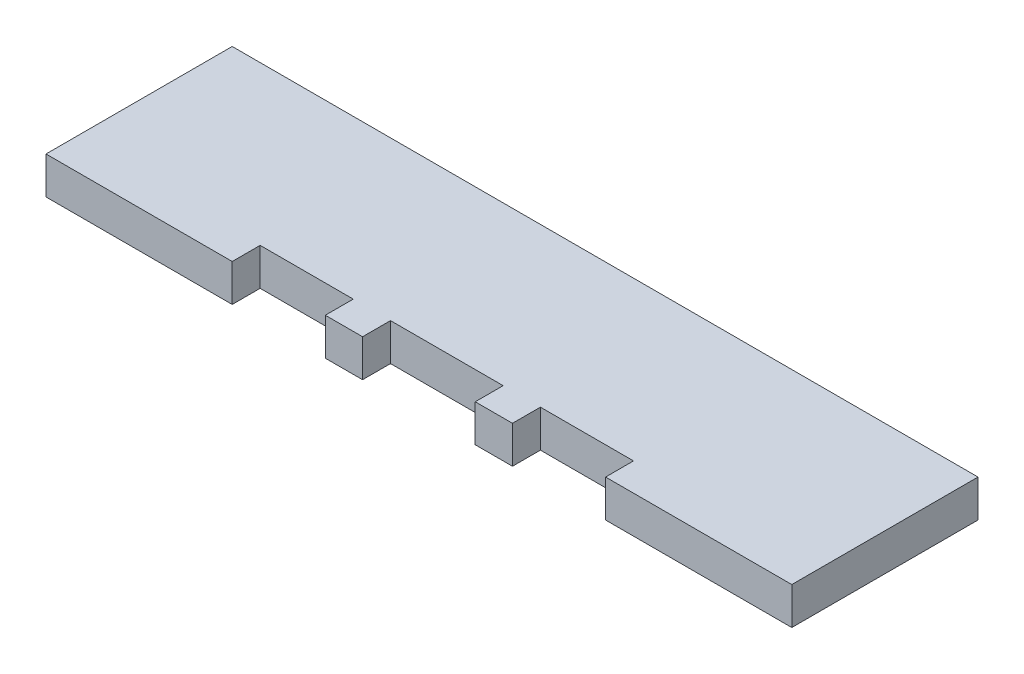
ISO-10303-21;
HEADER;
FILE_DESCRIPTION(('STEP AP214'),'2;1');
FILE_NAME('part.step','',(''),(''),'','','');
FILE_SCHEMA(('AUTOMOTIVE_DESIGN { 1 0 10303 214 1 1 1 1 }'));
ENDSEC;
DATA;
#1=APPLICATION_CONTEXT('core data for automotive mechanical design processes');
#2=APPLICATION_PROTOCOL_DEFINITION('international standard','automotive_design',2000,#1);
#3=PRODUCT_CONTEXT('',#1,'mechanical');
#4=PRODUCT('Part','Part','',(#3));
#5=PRODUCT_RELATED_PRODUCT_CATEGORY('part','',(#4));
#6=PRODUCT_DEFINITION_FORMATION('','',#4);
#7=PRODUCT_DEFINITION_CONTEXT('part definition',#1,'design');
#8=PRODUCT_DEFINITION('design','',#6,#7);
#9=PRODUCT_DEFINITION_SHAPE('','',#8);
#10=(LENGTH_UNIT() NAMED_UNIT(*) SI_UNIT(.MILLI.,.METRE.));
#11=(NAMED_UNIT(*) PLANE_ANGLE_UNIT() SI_UNIT($,.RADIAN.));
#12=(NAMED_UNIT(*) SI_UNIT($,.STERADIAN.) SOLID_ANGLE_UNIT());
#13=UNCERTAINTY_MEASURE_WITH_UNIT(LENGTH_MEASURE(1.E-05),#10,'distance_accuracy_value','');
#14=(GEOMETRIC_REPRESENTATION_CONTEXT(3) GLOBAL_UNCERTAINTY_ASSIGNED_CONTEXT((#13)) GLOBAL_UNIT_ASSIGNED_CONTEXT((#10,
#11,#12)) REPRESENTATION_CONTEXT('',''));
#15=CARTESIAN_POINT('',(0.,0.,0.));
#16=DIRECTION('',(0.,0.,1.));
#17=DIRECTION('',(1.,0.,0.));
#18=AXIS2_PLACEMENT_3D('',#15,#16,#17);
#19=CARTESIAN_POINT('',(0.,4.,-3.));
#20=DIRECTION('',(0.,0.,-1.));
#21=DIRECTION('',(-1.,0.,0.));
#22=AXIS2_PLACEMENT_3D('',#19,#20,#21);
#23=PLANE('',#22);
#24=DIRECTION('',(0.,-1.,0.));
#25=VECTOR('',#24,1.);
#26=CARTESIAN_POINT('',(10.,3.99999999999988,-3.));
#27=LINE('',#26,#25);
#28=CARTESIAN_POINT('',(10.,4.,-3.));
#29=VERTEX_POINT('',#28);
#30=CARTESIAN_POINT('',(10.,0.,-3.));
#31=VERTEX_POINT('',#30);
#32=EDGE_CURVE('E57',#29,#31,#27,.T.);
#33=ORIENTED_EDGE('',*,*,#32,.F.);
#34=DIRECTION('',(1.,0.,0.));
#35=VECTOR('',#34,1.);
#36=CARTESIAN_POINT('',(0.,4.,-3.));
#37=LINE('',#36,#35);
#38=CARTESIAN_POINT('',(0.,4.,-3.));
#39=VERTEX_POINT('',#38);
#40=EDGE_CURVE('E172',#39,#29,#37,.T.);
#41=ORIENTED_EDGE('',*,*,#40,.F.);
#42=DIRECTION('',(0.,-1.,0.));
#43=VECTOR('',#42,1.);
#44=CARTESIAN_POINT('',(0.,4.,-3.));
#45=LINE('',#44,#43);
#46=CARTESIAN_POINT('',(0.,0.,-3.));
#47=VERTEX_POINT('',#46);
#48=EDGE_CURVE('E42',#39,#47,#45,.T.);
#49=ORIENTED_EDGE('',*,*,#48,.T.);
#50=DIRECTION('',(1.,0.,0.));
#51=VECTOR('',#50,1.);
#52=CARTESIAN_POINT('',(0.,0.,-3.));
#53=LINE('',#52,#51);
#54=EDGE_CURVE('E229',#47,#31,#53,.T.);
#55=ORIENTED_EDGE('',*,*,#54,.T.);
#56=EDGE_LOOP('',(#33,#41,#49,#55));
#57=FACE_BOUND('',#56,.T.);
#58=ADVANCED_FACE('F34',(#57),#23,.F.);
#59=DIRECTION('',(0.,1.,0.));
#60=VECTOR('',#59,1.);
#61=CARTESIAN_POINT('',(14.,3.99999999999988,-3.));
#62=LINE('',#61,#60);
#63=CARTESIAN_POINT('',(14.,-1.23598439395047E-13,-3.));
#64=VERTEX_POINT('',#63);
#65=CARTESIAN_POINT('',(14.,4.,-3.));
#66=VERTEX_POINT('',#65);
#67=EDGE_CURVE('E168',#64,#66,#62,.T.);
#68=ORIENTED_EDGE('',*,*,#67,.F.);
#69=CARTESIAN_POINT('',(26.1,0.,-3.));
#70=VERTEX_POINT('',#69);
#71=EDGE_CURVE('E232',#64,#70,#53,.T.);
#72=ORIENTED_EDGE('',*,*,#71,.T.);
#73=DIRECTION('',(0.,-1.,0.));
#74=VECTOR('',#73,1.);
#75=CARTESIAN_POINT('',(26.1,4.,-3.));
#76=LINE('',#75,#74);
#77=CARTESIAN_POINT('',(26.1,4.,-3.));
#78=VERTEX_POINT('',#77);
#79=EDGE_CURVE('E173',#78,#70,#76,.T.);
#80=ORIENTED_EDGE('',*,*,#79,.F.);
#81=EDGE_CURVE('E49',#66,#78,#37,.T.);
#82=ORIENTED_EDGE('',*,*,#81,.F.);
#83=EDGE_LOOP('',(#68,#72,#80,#82));
#84=FACE_BOUND('',#83,.T.);
#85=ADVANCED_FACE('F277',(#84),#23,.F.);
#86=DIRECTION('',(0.,1.,0.));
#87=VECTOR('',#86,1.);
#88=CARTESIAN_POINT('',(30.1,4.,-3.));
#89=LINE('',#88,#87);
#90=CARTESIAN_POINT('',(30.1,0.,-3.));
#91=VERTEX_POINT('',#90);
#92=CARTESIAN_POINT('',(30.1,4.,-3.));
#93=VERTEX_POINT('',#92);
#94=EDGE_CURVE('E176',#91,#93,#89,.T.);
#95=ORIENTED_EDGE('',*,*,#94,.F.);
#96=CARTESIAN_POINT('',(40.1,0.,-3.));
#97=VERTEX_POINT('',#96);
#98=EDGE_CURVE('E228',#91,#97,#53,.T.);
#99=ORIENTED_EDGE('',*,*,#98,.T.);
#100=DIRECTION('',(0.,-1.,0.));
#101=VECTOR('',#100,1.);
#102=CARTESIAN_POINT('',(40.1,4.,-3.));
#103=LINE('',#102,#101);
#104=CARTESIAN_POINT('',(40.1,4.,-3.));
#105=VERTEX_POINT('',#104);
#106=EDGE_CURVE('E255',#105,#97,#103,.T.);
#107=ORIENTED_EDGE('',*,*,#106,.F.);
#108=EDGE_CURVE('E211',#93,#105,#37,.T.);
#109=ORIENTED_EDGE('',*,*,#108,.F.);
#110=EDGE_LOOP('',(#95,#99,#107,#109));
#111=FACE_BOUND('',#110,.T.);
#112=ADVANCED_FACE('F291',(#111),#23,.F.);
#113=CARTESIAN_POINT('',(-20.,4.,0.));
#114=DIRECTION('',(0.,0.,-1.));
#115=DIRECTION('',(-1.,0.,0.));
#116=AXIS2_PLACEMENT_3D('',#113,#114,#115);
#117=PLANE('',#116);
#118=DIRECTION('',(1.,0.,0.));
#119=VECTOR('',#118,1.);
#120=CARTESIAN_POINT('',(-20.,0.,0.));
#121=LINE('',#120,#119);
#122=CARTESIAN_POINT('',(-20.,0.,0.));
#123=VERTEX_POINT('',#122);
#124=CARTESIAN_POINT('',(0.,0.,0.));
#125=VERTEX_POINT('',#124);
#126=EDGE_CURVE('E205',#123,#125,#121,.T.);
#127=ORIENTED_EDGE('',*,*,#126,.T.);
#128=DIRECTION('',(0.,-1.,0.));
#129=VECTOR('',#128,1.);
#130=CARTESIAN_POINT('',(0.,4.,0.));
#131=LINE('',#130,#129);
#132=CARTESIAN_POINT('',(0.,4.,0.));
#133=VERTEX_POINT('',#132);
#134=EDGE_CURVE('E11',#133,#125,#131,.T.);
#135=ORIENTED_EDGE('',*,*,#134,.F.);
#136=DIRECTION('',(1.,0.,0.));
#137=VECTOR('',#136,1.);
#138=CARTESIAN_POINT('',(-20.,4.,0.));
#139=LINE('',#138,#137);
#140=CARTESIAN_POINT('',(-20.,4.,0.));
#141=VERTEX_POINT('',#140);
#142=EDGE_CURVE('E206',#141,#133,#139,.T.);
#143=ORIENTED_EDGE('',*,*,#142,.F.);
#144=DIRECTION('',(0.,-1.,0.));
#145=VECTOR('',#144,1.);
#146=CARTESIAN_POINT('',(-20.,4.,0.));
#147=LINE('',#146,#145);
#148=EDGE_CURVE('E223',#141,#123,#147,.T.);
#149=ORIENTED_EDGE('',*,*,#148,.T.);
#150=EDGE_LOOP('',(#127,#135,#143,#149));
#151=FACE_BOUND('',#150,.T.);
#152=ADVANCED_FACE('F36',(#151),#117,.F.);
#153=CARTESIAN_POINT('',(0.,4.,0.));
#154=DIRECTION('',(-1.,0.,0.));
#155=DIRECTION('',(0.,0.,1.));
#156=AXIS2_PLACEMENT_3D('',#153,#154,#155);
#157=PLANE('',#156);
#158=DIRECTION('',(0.,0.,-1.));
#159=VECTOR('',#158,1.);
#160=CARTESIAN_POINT('',(0.,0.,0.));
#161=LINE('',#160,#159);
#162=EDGE_CURVE('E226',#125,#47,#161,.T.);
#163=ORIENTED_EDGE('',*,*,#162,.T.);
#164=ORIENTED_EDGE('',*,*,#48,.F.);
#165=DIRECTION('',(0.,0.,-1.));
#166=VECTOR('',#165,1.);
#167=CARTESIAN_POINT('',(0.,4.,0.));
#168=LINE('',#167,#166);
#169=EDGE_CURVE('E208',#133,#39,#168,.T.);
#170=ORIENTED_EDGE('',*,*,#169,.F.);
#171=ORIENTED_EDGE('',*,*,#134,.T.);
#172=EDGE_LOOP('',(#163,#164,#170,#171));
#173=FACE_BOUND('',#172,.T.);
#174=ADVANCED_FACE('F320',(#173),#157,.F.);
#175=CARTESIAN_POINT('',(40.1,4.,-3.));
#176=DIRECTION('',(1.,0.,0.));
#177=DIRECTION('',(0.,0.,-1.));
#178=AXIS2_PLACEMENT_3D('',#175,#176,#177);
#179=PLANE('',#178);
#180=DIRECTION('',(0.,0.,1.));
#181=VECTOR('',#180,1.);
#182=CARTESIAN_POINT('',(40.1,0.,-3.));
#183=LINE('',#182,#181);
#184=CARTESIAN_POINT('',(40.1,0.,0.));
#185=VERTEX_POINT('',#184);
#186=EDGE_CURVE('E231',#97,#185,#183,.T.);
#187=ORIENTED_EDGE('',*,*,#186,.T.);
#188=DIRECTION('',(0.,-1.,0.));
#189=VECTOR('',#188,1.);
#190=CARTESIAN_POINT('',(40.1,4.,0.));
#191=LINE('',#190,#189);
#192=CARTESIAN_POINT('',(40.1,4.,0.));
#193=VERTEX_POINT('',#192);
#194=EDGE_CURVE('E252',#193,#185,#191,.T.);
#195=ORIENTED_EDGE('',*,*,#194,.F.);
#196=DIRECTION('',(0.,0.,1.));
#197=VECTOR('',#196,1.);
#198=CARTESIAN_POINT('',(40.1,4.,-3.));
#199=LINE('',#198,#197);
#200=EDGE_CURVE('E213',#105,#193,#199,.T.);
#201=ORIENTED_EDGE('',*,*,#200,.F.);
#202=ORIENTED_EDGE('',*,*,#106,.T.);
#203=EDGE_LOOP('',(#187,#195,#201,#202));
#204=FACE_BOUND('',#203,.T.);
#205=ADVANCED_FACE('F296',(#204),#179,.F.);
#206=CARTESIAN_POINT('',(40.1,4.,0.));
#207=DIRECTION('',(0.,0.,-1.));
#208=DIRECTION('',(-1.,0.,0.));
#209=AXIS2_PLACEMENT_3D('',#206,#207,#208);
#210=PLANE('',#209);
#211=DIRECTION('',(1.,0.,0.));
#212=VECTOR('',#211,1.);
#213=CARTESIAN_POINT('',(40.1,0.,0.));
#214=LINE('',#213,#212);
#215=CARTESIAN_POINT('',(60.1,0.,0.));
#216=VERTEX_POINT('',#215);
#217=EDGE_CURVE('E234',#185,#216,#214,.T.);
#218=ORIENTED_EDGE('',*,*,#217,.T.);
#219=DIRECTION('',(0.,-1.,0.));
#220=VECTOR('',#219,1.);
#221=CARTESIAN_POINT('',(60.1,4.,0.));
#222=LINE('',#221,#220);
#223=CARTESIAN_POINT('',(60.1,4.,0.));
#224=VERTEX_POINT('',#223);
#225=EDGE_CURVE('E249',#224,#216,#222,.T.);
#226=ORIENTED_EDGE('',*,*,#225,.F.);
#227=DIRECTION('',(1.,0.,0.));
#228=VECTOR('',#227,1.);
#229=CARTESIAN_POINT('',(40.1,4.,0.));
#230=LINE('',#229,#228);
#231=EDGE_CURVE('E215',#193,#224,#230,.T.);
#232=ORIENTED_EDGE('',*,*,#231,.F.);
#233=ORIENTED_EDGE('',*,*,#194,.T.);
#234=EDGE_LOOP('',(#218,#226,#232,#233));
#235=FACE_BOUND('',#234,.T.);
#236=ADVANCED_FACE('F302',(#235),#210,.F.);
#237=CARTESIAN_POINT('',(60.1,4.,0.));
#238=DIRECTION('',(-1.,0.,0.));
#239=DIRECTION('',(0.,0.,1.));
#240=AXIS2_PLACEMENT_3D('',#237,#238,#239);
#241=PLANE('',#240);
#242=DIRECTION('',(0.,0.,-1.));
#243=VECTOR('',#242,1.);
#244=CARTESIAN_POINT('',(60.1,0.,0.));
#245=LINE('',#244,#243);
#246=CARTESIAN_POINT('',(60.1,0.,-20.));
#247=VERTEX_POINT('',#246);
#248=EDGE_CURVE('E236',#216,#247,#245,.T.);
#249=ORIENTED_EDGE('',*,*,#248,.T.);
#250=DIRECTION('',(0.,-1.,0.));
#251=VECTOR('',#250,1.);
#252=CARTESIAN_POINT('',(60.1,4.,-20.));
#253=LINE('',#252,#251);
#254=CARTESIAN_POINT('',(60.1,4.,-20.));
#255=VERTEX_POINT('',#254);
#256=EDGE_CURVE('E246',#255,#247,#253,.T.);
#257=ORIENTED_EDGE('',*,*,#256,.F.);
#258=DIRECTION('',(0.,0.,-1.));
#259=VECTOR('',#258,1.);
#260=CARTESIAN_POINT('',(60.1,4.,0.));
#261=LINE('',#260,#259);
#262=EDGE_CURVE('E217',#224,#255,#261,.T.);
#263=ORIENTED_EDGE('',*,*,#262,.F.);
#264=ORIENTED_EDGE('',*,*,#225,.T.);
#265=EDGE_LOOP('',(#249,#257,#263,#264));
#266=FACE_BOUND('',#265,.T.);
#267=ADVANCED_FACE('F306',(#266),#241,.F.);
#268=CARTESIAN_POINT('',(60.1,4.,-20.));
#269=DIRECTION('',(0.,0.,1.));
#270=DIRECTION('',(1.,0.,0.));
#271=AXIS2_PLACEMENT_3D('',#268,#269,#270);
#272=PLANE('',#271);
#273=DIRECTION('',(-1.,0.,0.));
#274=VECTOR('',#273,1.);
#275=CARTESIAN_POINT('',(60.1,0.,-20.));
#276=LINE('',#275,#274);
#277=CARTESIAN_POINT('',(-20.,0.,-20.));
#278=VERTEX_POINT('',#277);
#279=EDGE_CURVE('E238',#247,#278,#276,.T.);
#280=ORIENTED_EDGE('',*,*,#279,.T.);
#281=DIRECTION('',(0.,-1.,0.));
#282=VECTOR('',#281,1.);
#283=CARTESIAN_POINT('',(-20.,4.,-20.));
#284=LINE('',#283,#282);
#285=CARTESIAN_POINT('',(-20.,4.,-20.));
#286=VERTEX_POINT('',#285);
#287=EDGE_CURVE('E243',#286,#278,#284,.T.);
#288=ORIENTED_EDGE('',*,*,#287,.F.);
#289=DIRECTION('',(-1.,0.,0.));
#290=VECTOR('',#289,1.);
#291=CARTESIAN_POINT('',(60.1,4.,-20.));
#292=LINE('',#291,#290);
#293=EDGE_CURVE('E219',#255,#286,#292,.T.);
#294=ORIENTED_EDGE('',*,*,#293,.F.);
#295=ORIENTED_EDGE('',*,*,#256,.T.);
#296=EDGE_LOOP('',(#280,#288,#294,#295));
#297=FACE_BOUND('',#296,.T.);
#298=ADVANCED_FACE('F311',(#297),#272,.F.);
#299=CARTESIAN_POINT('',(-20.,4.,-20.));
#300=DIRECTION('',(1.,0.,0.));
#301=DIRECTION('',(0.,0.,-1.));
#302=AXIS2_PLACEMENT_3D('',#299,#300,#301);
#303=PLANE('',#302);
#304=DIRECTION('',(0.,0.,1.));
#305=VECTOR('',#304,1.);
#306=CARTESIAN_POINT('',(-20.,0.,-20.));
#307=LINE('',#306,#305);
#308=EDGE_CURVE('E209',#278,#123,#307,.T.);
#309=ORIENTED_EDGE('',*,*,#308,.T.);
#310=ORIENTED_EDGE('',*,*,#148,.F.);
#311=DIRECTION('',(0.,0.,1.));
#312=VECTOR('',#311,1.);
#313=CARTESIAN_POINT('',(-20.,4.,-20.));
#314=LINE('',#313,#312);
#315=EDGE_CURVE('E221',#286,#141,#314,.T.);
#316=ORIENTED_EDGE('',*,*,#315,.F.);
#317=ORIENTED_EDGE('',*,*,#287,.T.);
#318=EDGE_LOOP('',(#309,#310,#316,#317));
#319=FACE_BOUND('',#318,.T.);
#320=ADVANCED_FACE('F317',(#319),#303,.F.);
#321=CARTESIAN_POINT('',(0.,4.,0.));
#322=DIRECTION('',(0.,1.,0.));
#323=DIRECTION('',(0.,0.,1.));
#324=AXIS2_PLACEMENT_3D('',#321,#322,#323);
#325=PLANE('',#324);
#326=ORIENTED_EDGE('',*,*,#142,.T.);
#327=ORIENTED_EDGE('',*,*,#169,.T.);
#328=ORIENTED_EDGE('',*,*,#40,.T.);
#329=DIRECTION('',(0.,0.,-1.));
#330=VECTOR('',#329,1.);
#331=CARTESIAN_POINT('',(10.,3.99999999999988,0.));
#332=LINE('',#331,#330);
#333=CARTESIAN_POINT('',(10.,3.99999999999988,0.));
#334=VERTEX_POINT('',#333);
#335=EDGE_CURVE('E153',#334,#29,#332,.T.);
#336=ORIENTED_EDGE('',*,*,#335,.F.);
#337=DIRECTION('',(-1.,0.,0.));
#338=VECTOR('',#337,1.);
#339=CARTESIAN_POINT('',(10.,3.99999999999988,0.));
#340=LINE('',#339,#338);
#341=CARTESIAN_POINT('',(14.,3.99999999999988,0.));
#342=VERTEX_POINT('',#341);
#343=EDGE_CURVE('E159',#342,#334,#340,.T.);
#344=ORIENTED_EDGE('',*,*,#343,.F.);
#345=DIRECTION('',(0.,0.,-1.));
#346=VECTOR('',#345,1.);
#347=CARTESIAN_POINT('',(14.,3.99999999999988,0.));
#348=LINE('',#347,#346);
#349=EDGE_CURVE('E267',#342,#66,#348,.T.);
#350=ORIENTED_EDGE('',*,*,#349,.T.);
#351=ORIENTED_EDGE('',*,*,#81,.T.);
#352=DIRECTION('',(0.,0.,-1.));
#353=VECTOR('',#352,1.);
#354=CARTESIAN_POINT('',(26.1,4.,0.));
#355=LINE('',#354,#353);
#356=CARTESIAN_POINT('',(26.1,4.,0.));
#357=VERTEX_POINT('',#356);
#358=EDGE_CURVE('E190',#357,#78,#355,.T.);
#359=ORIENTED_EDGE('',*,*,#358,.F.);
#360=DIRECTION('',(-1.,0.,0.));
#361=VECTOR('',#360,1.);
#362=CARTESIAN_POINT('',(26.1,4.,0.));
#363=LINE('',#362,#361);
#364=CARTESIAN_POINT('',(30.1,4.,0.));
#365=VERTEX_POINT('',#364);
#366=EDGE_CURVE('E189',#365,#357,#363,.T.);
#367=ORIENTED_EDGE('',*,*,#366,.F.);
#368=DIRECTION('',(0.,0.,-1.));
#369=VECTOR('',#368,1.);
#370=CARTESIAN_POINT('',(30.1,4.,0.));
#371=LINE('',#370,#369);
#372=EDGE_CURVE('E196',#365,#93,#371,.T.);
#373=ORIENTED_EDGE('',*,*,#372,.T.);
#374=ORIENTED_EDGE('',*,*,#108,.T.);
#375=ORIENTED_EDGE('',*,*,#200,.T.);
#376=ORIENTED_EDGE('',*,*,#231,.T.);
#377=ORIENTED_EDGE('',*,*,#262,.T.);
#378=ORIENTED_EDGE('',*,*,#293,.T.);
#379=ORIENTED_EDGE('',*,*,#315,.T.);
#380=EDGE_LOOP('',(#326,#327,#328,#336,#344,#350,#351,#359,#367,#373,#374,#375,#376,#377,#378,#379));
#381=FACE_BOUND('',#380,.T.);
#382=ADVANCED_FACE('F171',(#381),#325,.T.);
#383=CARTESIAN_POINT('',(0.,0.,0.));
#384=DIRECTION('',(0.,1.,0.));
#385=DIRECTION('',(0.,0.,1.));
#386=AXIS2_PLACEMENT_3D('',#383,#384,#385);
#387=PLANE('',#386);
#388=ORIENTED_EDGE('',*,*,#126,.F.);
#389=ORIENTED_EDGE('',*,*,#308,.F.);
#390=ORIENTED_EDGE('',*,*,#279,.F.);
#391=ORIENTED_EDGE('',*,*,#248,.F.);
#392=ORIENTED_EDGE('',*,*,#217,.F.);
#393=ORIENTED_EDGE('',*,*,#186,.F.);
#394=ORIENTED_EDGE('',*,*,#98,.F.);
#395=DIRECTION('',(0.,0.,-1.));
#396=VECTOR('',#395,1.);
#397=CARTESIAN_POINT('',(30.1,0.,0.));
#398=LINE('',#397,#396);
#399=CARTESIAN_POINT('',(30.1,0.,0.));
#400=VERTEX_POINT('',#399);
#401=EDGE_CURVE('E199',#400,#91,#398,.T.);
#402=ORIENTED_EDGE('',*,*,#401,.F.);
#403=DIRECTION('',(1.,0.,0.));
#404=VECTOR('',#403,1.);
#405=CARTESIAN_POINT('',(26.1,0.,0.));
#406=LINE('',#405,#404);
#407=CARTESIAN_POINT('',(26.1,0.,0.));
#408=VERTEX_POINT('',#407);
#409=EDGE_CURVE('E185',#408,#400,#406,.T.);
#410=ORIENTED_EDGE('',*,*,#409,.F.);
#411=DIRECTION('',(0.,0.,-1.));
#412=VECTOR('',#411,1.);
#413=CARTESIAN_POINT('',(26.1,0.,0.));
#414=LINE('',#413,#412);
#415=EDGE_CURVE('E202',#408,#70,#414,.T.);
#416=ORIENTED_EDGE('',*,*,#415,.T.);
#417=ORIENTED_EDGE('',*,*,#71,.F.);
#418=DIRECTION('',(0.,0.,-1.));
#419=VECTOR('',#418,1.);
#420=CARTESIAN_POINT('',(14.,-1.23598439395047E-13,0.));
#421=LINE('',#420,#419);
#422=CARTESIAN_POINT('',(14.,-1.23598439395047E-13,0.));
#423=VERTEX_POINT('',#422);
#424=EDGE_CURVE('E178',#423,#64,#421,.T.);
#425=ORIENTED_EDGE('',*,*,#424,.F.);
#426=DIRECTION('',(1.,0.,0.));
#427=VECTOR('',#426,1.);
#428=CARTESIAN_POINT('',(10.,-1.23598439395047E-13,0.));
#429=LINE('',#428,#427);
#430=CARTESIAN_POINT('',(10.,-1.23598439395047E-13,0.));
#431=VERTEX_POINT('',#430);
#432=EDGE_CURVE('E158',#431,#423,#429,.T.);
#433=ORIENTED_EDGE('',*,*,#432,.F.);
#434=DIRECTION('',(0.,0.,-1.));
#435=VECTOR('',#434,1.);
#436=CARTESIAN_POINT('',(10.,-1.23598439395047E-13,0.));
#437=LINE('',#436,#435);
#438=EDGE_CURVE('E155',#431,#31,#437,.T.);
#439=ORIENTED_EDGE('',*,*,#438,.T.);
#440=ORIENTED_EDGE('',*,*,#54,.F.);
#441=ORIENTED_EDGE('',*,*,#162,.F.);
#442=EDGE_LOOP('',(#388,#389,#390,#391,#392,#393,#394,#402,#410,#416,#417,#425,#433,#439,#440,#441));
#443=FACE_BOUND('',#442,.T.);
#444=ADVANCED_FACE('F263',(#443),#387,.F.);
#445=CARTESIAN_POINT('',(26.1,4.,0.));
#446=DIRECTION('',(1.,0.,0.));
#447=DIRECTION('',(0.,0.,-1.));
#448=AXIS2_PLACEMENT_3D('',#445,#446,#447);
#449=PLANE('',#448);
#450=ORIENTED_EDGE('',*,*,#79,.T.);
#451=ORIENTED_EDGE('',*,*,#415,.F.);
#452=DIRECTION('',(0.,-1.,0.));
#453=VECTOR('',#452,1.);
#454=CARTESIAN_POINT('',(26.1,4.,0.));
#455=LINE('',#454,#453);
#456=EDGE_CURVE('E182',#357,#408,#455,.T.);
#457=ORIENTED_EDGE('',*,*,#456,.F.);
#458=ORIENTED_EDGE('',*,*,#358,.T.);
#459=EDGE_LOOP('',(#450,#451,#457,#458));
#460=FACE_BOUND('',#459,.T.);
#461=ADVANCED_FACE('F280',(#460),#449,.F.);
#462=CARTESIAN_POINT('',(30.1,4.,0.));
#463=DIRECTION('',(-1.,0.,0.));
#464=DIRECTION('',(0.,0.,1.));
#465=AXIS2_PLACEMENT_3D('',#462,#463,#464);
#466=PLANE('',#465);
#467=ORIENTED_EDGE('',*,*,#94,.T.);
#468=ORIENTED_EDGE('',*,*,#372,.F.);
#469=DIRECTION('',(0.,1.,0.));
#470=VECTOR('',#469,1.);
#471=CARTESIAN_POINT('',(30.1,4.,0.));
#472=LINE('',#471,#470);
#473=EDGE_CURVE('E187',#400,#365,#472,.T.);
#474=ORIENTED_EDGE('',*,*,#473,.F.);
#475=ORIENTED_EDGE('',*,*,#401,.T.);
#476=EDGE_LOOP('',(#467,#468,#474,#475));
#477=FACE_BOUND('',#476,.T.);
#478=ADVANCED_FACE('F288',(#477),#466,.F.);
#479=CARTESIAN_POINT('',(0.,0.,0.));
#480=DIRECTION('',(0.,0.,1.));
#481=DIRECTION('',(1.,0.,0.));
#482=AXIS2_PLACEMENT_3D('',#479,#480,#481);
#483=PLANE('',#482);
#484=ORIENTED_EDGE('',*,*,#456,.T.);
#485=ORIENTED_EDGE('',*,*,#409,.T.);
#486=ORIENTED_EDGE('',*,*,#473,.T.);
#487=ORIENTED_EDGE('',*,*,#366,.T.);
#488=EDGE_LOOP('',(#484,#485,#486,#487));
#489=FACE_BOUND('',#488,.T.);
#490=ADVANCED_FACE('F282',(#489),#483,.T.);
#491=CARTESIAN_POINT('',(10.,3.99999999999988,0.));
#492=DIRECTION('',(1.,0.,0.));
#493=DIRECTION('',(0.,0.,-1.));
#494=AXIS2_PLACEMENT_3D('',#491,#492,#493);
#495=PLANE('',#494);
#496=ORIENTED_EDGE('',*,*,#32,.T.);
#497=ORIENTED_EDGE('',*,*,#438,.F.);
#498=DIRECTION('',(0.,-1.,0.));
#499=VECTOR('',#498,1.);
#500=CARTESIAN_POINT('',(10.,3.99999999999988,0.));
#501=LINE('',#500,#499);
#502=EDGE_CURVE('E149',#334,#431,#501,.T.);
#503=ORIENTED_EDGE('',*,*,#502,.F.);
#504=ORIENTED_EDGE('',*,*,#335,.T.);
#505=EDGE_LOOP('',(#496,#497,#503,#504));
#506=FACE_BOUND('',#505,.T.);
#507=ADVANCED_FACE('F151',(#506),#495,.F.);
#508=CARTESIAN_POINT('',(14.,3.99999999999988,0.));
#509=DIRECTION('',(-1.,0.,0.));
#510=DIRECTION('',(0.,0.,1.));
#511=AXIS2_PLACEMENT_3D('',#508,#509,#510);
#512=PLANE('',#511);
#513=ORIENTED_EDGE('',*,*,#67,.T.);
#514=ORIENTED_EDGE('',*,*,#349,.F.);
#515=DIRECTION('',(0.,1.,0.));
#516=VECTOR('',#515,1.);
#517=CARTESIAN_POINT('',(14.,3.99999999999988,0.));
#518=LINE('',#517,#516);
#519=EDGE_CURVE('E164',#423,#342,#518,.T.);
#520=ORIENTED_EDGE('',*,*,#519,.F.);
#521=ORIENTED_EDGE('',*,*,#424,.T.);
#522=EDGE_LOOP('',(#513,#514,#520,#521));
#523=FACE_BOUND('',#522,.T.);
#524=ADVANCED_FACE('F273',(#523),#512,.F.);
#525=CARTESIAN_POINT('',(0.,0.,0.));
#526=DIRECTION('',(0.,0.,-1.));
#527=DIRECTION('',(-1.,0.,0.));
#528=AXIS2_PLACEMENT_3D('',#525,#526,#527);
#529=PLANE('',#528);
#530=ORIENTED_EDGE('',*,*,#343,.T.);
#531=ORIENTED_EDGE('',*,*,#502,.T.);
#532=ORIENTED_EDGE('',*,*,#432,.T.);
#533=ORIENTED_EDGE('',*,*,#519,.T.);
#534=EDGE_LOOP('',(#530,#531,#532,#533));
#535=FACE_BOUND('',#534,.T.);
#536=ADVANCED_FACE('F162',(#535),#529,.F.);
#537=CLOSED_SHELL('',(#58,#85,#112,#152,#174,#205,#236,#267,#298,#320,#382,#444,#461,#478,#490,
#507,#524,#536));
#538=MANIFOLD_SOLID_BREP('B2',#537);
#539=ADVANCED_BREP_SHAPE_REPRESENTATION('',(#18,#538),#14);
#540=SHAPE_DEFINITION_REPRESENTATION(#9,#539);
ENDSEC;
END-ISO-10303-21;
